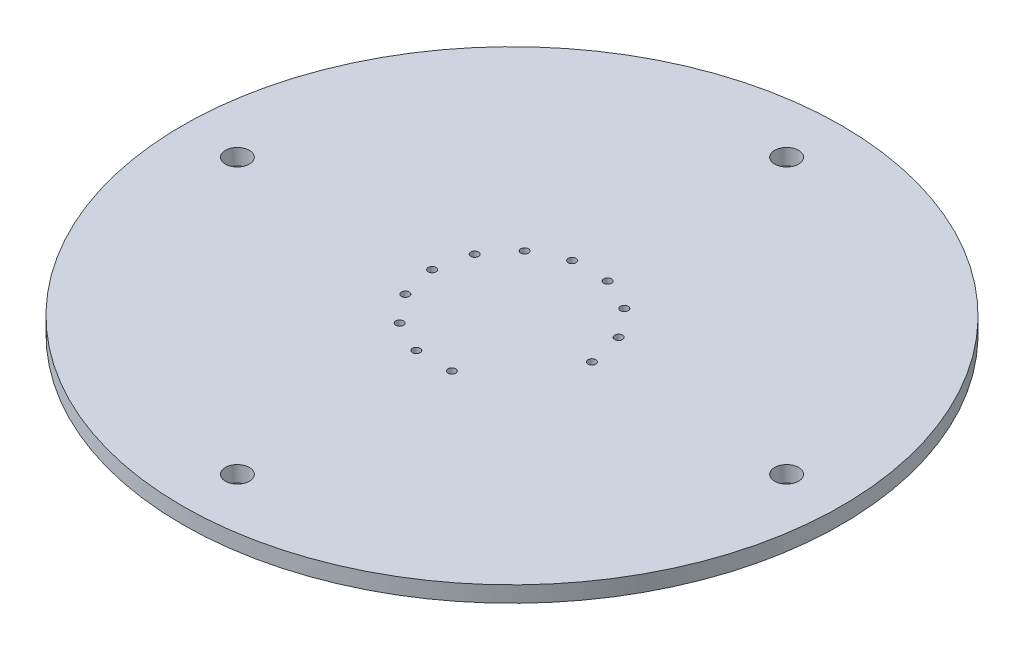
ISO-10303-21;
HEADER;
FILE_DESCRIPTION(('STEP AP214'),'2;1');
FILE_NAME('part.step','',(''),(''),'','','');
FILE_SCHEMA(('AUTOMOTIVE_DESIGN { 1 0 10303 214 1 1 1 1 }'));
ENDSEC;
DATA;
#1=APPLICATION_CONTEXT('core data for automotive mechanical design processes');
#2=APPLICATION_PROTOCOL_DEFINITION('international standard','automotive_design',2000,#1);
#3=PRODUCT_CONTEXT('',#1,'mechanical');
#4=PRODUCT('Part','Part','',(#3));
#5=PRODUCT_RELATED_PRODUCT_CATEGORY('part','',(#4));
#6=PRODUCT_DEFINITION_FORMATION('','',#4);
#7=PRODUCT_DEFINITION_CONTEXT('part definition',#1,'design');
#8=PRODUCT_DEFINITION('design','',#6,#7);
#9=PRODUCT_DEFINITION_SHAPE('','',#8);
#10=(LENGTH_UNIT() NAMED_UNIT(*) SI_UNIT(.MILLI.,.METRE.));
#11=(NAMED_UNIT(*) PLANE_ANGLE_UNIT() SI_UNIT($,.RADIAN.));
#12=(NAMED_UNIT(*) SI_UNIT($,.STERADIAN.) SOLID_ANGLE_UNIT());
#13=UNCERTAINTY_MEASURE_WITH_UNIT(LENGTH_MEASURE(1.E-05),#10,'distance_accuracy_value','');
#14=(GEOMETRIC_REPRESENTATION_CONTEXT(3) GLOBAL_UNCERTAINTY_ASSIGNED_CONTEXT((#13)) GLOBAL_UNIT_ASSIGNED_CONTEXT((#10,
#11,#12)) REPRESENTATION_CONTEXT('',''));
#15=CARTESIAN_POINT('',(0.,0.,0.));
#16=DIRECTION('',(0.,0.,1.));
#17=DIRECTION('',(1.,0.,0.));
#18=AXIS2_PLACEMENT_3D('',#15,#16,#17);
#19=CARTESIAN_POINT('',(0.,1.6,0.));
#20=DIRECTION('',(0.,-1.,0.));
#21=DIRECTION('',(0.,0.,-1.));
#22=AXIS2_PLACEMENT_3D('',#19,#20,#21);
#23=CYLINDRICAL_SURFACE('',#22,33.);
#24=CARTESIAN_POINT('',(0.,1.6,0.));
#25=DIRECTION('',(0.,1.,0.));
#26=DIRECTION('',(0.,0.,1.));
#27=AXIS2_PLACEMENT_3D('',#24,#25,#26);
#28=CIRCLE('',#27,33.);
#29=CARTESIAN_POINT('',(0.,1.6,33.));
#30=VERTEX_POINT('',#29);
#31=EDGE_CURVE('E10',#30,#30,#28,.T.);
#32=ORIENTED_EDGE('',*,*,#31,.F.);
#33=EDGE_LOOP('',(#32));
#34=FACE_BOUND('',#33,.T.);
#35=CARTESIAN_POINT('',(0.,0.,0.));
#36=DIRECTION('',(0.,1.,0.));
#37=DIRECTION('',(0.,0.,1.));
#38=AXIS2_PLACEMENT_3D('',#35,#36,#37);
#39=CIRCLE('',#38,33.);
#40=CARTESIAN_POINT('',(0.,0.,33.));
#41=VERTEX_POINT('',#40);
#42=EDGE_CURVE('E37',#41,#41,#39,.T.);
#43=ORIENTED_EDGE('',*,*,#42,.T.);
#44=EDGE_LOOP('',(#43));
#45=FACE_BOUND('',#44,.T.);
#46=ADVANCED_FACE('F30',(#34,#45),#23,.T.);
#47=CARTESIAN_POINT('',(0.,1.6,0.));
#48=DIRECTION('',(0.,1.,0.));
#49=DIRECTION('',(0.,0.,1.));
#50=AXIS2_PLACEMENT_3D('',#47,#48,#49);
#51=PLANE('',#50);
#52=CARTESIAN_POINT('',(-4.98791841486977,1.6,-6.25465185974432));
#53=DIRECTION('',(0.,1.,0.));
#54=DIRECTION('',(0.,0.,1.));
#55=AXIS2_PLACEMENT_3D('',#52,#53,#54);
#56=CIRCLE('',#55,0.39);
#57=CARTESIAN_POINT('',(-4.98791841486977,1.6,-5.86465185974432));
#58=VERTEX_POINT('',#57);
#59=EDGE_CURVE('E113',#58,#58,#56,.T.);
#60=ORIENTED_EDGE('',*,*,#59,.F.);
#61=EDGE_LOOP('',(#60));
#62=FACE_BOUND('',#61,.T.);
#63=CARTESIAN_POINT('',(-7.2077509432193,1.6,-3.47106991294058));
#64=DIRECTION('',(0.,1.,0.));
#65=DIRECTION('',(0.,0.,1.));
#66=AXIS2_PLACEMENT_3D('',#63,#64,#65);
#67=CIRCLE('',#66,0.39);
#68=CARTESIAN_POINT('',(-7.2077509432193,1.6,-3.08106991294058));
#69=VERTEX_POINT('',#68);
#70=EDGE_CURVE('E103',#69,#69,#67,.T.);
#71=ORIENTED_EDGE('',*,*,#70,.F.);
#72=EDGE_LOOP('',(#71));
#73=FACE_BOUND('',#72,.T.);
#74=CARTESIAN_POINT('',(-7.99999999999989,1.6,0.));
#75=DIRECTION('',(0.,1.,0.));
#76=DIRECTION('',(0.,0.,1.));
#77=AXIS2_PLACEMENT_3D('',#74,#75,#76);
#78=CIRCLE('',#77,0.390000000000175);
#79=CARTESIAN_POINT('',(-7.99999999999989,1.6,0.390000000000235));
#80=VERTEX_POINT('',#79);
#81=EDGE_CURVE('E100',#80,#80,#78,.T.);
#82=ORIENTED_EDGE('',*,*,#81,.F.);
#83=EDGE_LOOP('',(#82));
#84=FACE_BOUND('',#83,.T.);
#85=CARTESIAN_POINT('',(-7.20775094321921,1.6,3.47106991294052));
#86=DIRECTION('',(0.,1.,0.));
#87=DIRECTION('',(0.,0.,1.));
#88=AXIS2_PLACEMENT_3D('',#85,#86,#87);
#89=CIRCLE('',#88,0.390000000000215);
#90=CARTESIAN_POINT('',(-7.20775094321921,1.6,3.86106991294073));
#91=VERTEX_POINT('',#90);
#92=EDGE_CURVE('E97',#91,#91,#89,.T.);
#93=ORIENTED_EDGE('',*,*,#92,.F.);
#94=EDGE_LOOP('',(#93));
#95=FACE_BOUND('',#94,.T.);
#96=CARTESIAN_POINT('',(-4.9879184148697,1.6,6.25465185974427));
#97=DIRECTION('',(0.,1.,0.));
#98=DIRECTION('',(0.,0.,1.));
#99=AXIS2_PLACEMENT_3D('',#96,#97,#98);
#100=CIRCLE('',#99,0.390000000000247);
#101=CARTESIAN_POINT('',(-4.9879184148697,1.6,6.64465185974451));
#102=VERTEX_POINT('',#101);
#103=EDGE_CURVE('E93',#102,#102,#100,.T.);
#104=ORIENTED_EDGE('',*,*,#103,.F.);
#105=EDGE_LOOP('',(#104));
#106=FACE_BOUND('',#105,.T.);
#107=CARTESIAN_POINT('',(-1.78016747165033,1.6,7.79942329745458));
#108=DIRECTION('',(0.,1.,0.));
#109=DIRECTION('',(0.,0.,1.));
#110=AXIS2_PLACEMENT_3D('',#107,#108,#109);
#111=CIRCLE('',#110,0.390000000000271);
#112=CARTESIAN_POINT('',(-1.78016747165033,1.6,8.18942329745485));
#113=VERTEX_POINT('',#112);
#114=EDGE_CURVE('E89',#113,#113,#111,.T.);
#115=ORIENTED_EDGE('',*,*,#114,.F.);
#116=EDGE_LOOP('',(#115));
#117=FACE_BOUND('',#116,.T.);
#118=CARTESIAN_POINT('',(1.7801674716507,1.6,7.79942329745455));
#119=DIRECTION('',(0.,1.,0.));
#120=DIRECTION('',(0.,0.,1.));
#121=AXIS2_PLACEMENT_3D('',#118,#119,#120);
#122=CIRCLE('',#121,0.390000000000271);
#123=CARTESIAN_POINT('',(1.7801674716507,1.6,8.18942329745482));
#124=VERTEX_POINT('',#123);
#125=EDGE_CURVE('E85',#124,#124,#122,.T.);
#126=ORIENTED_EDGE('',*,*,#125,.F.);
#127=EDGE_LOOP('',(#126));
#128=FACE_BOUND('',#127,.T.);
#129=CARTESIAN_POINT('',(8.00000000000011,1.6,-1.08850241781335E-13));
#130=DIRECTION('',(0.,1.,0.));
#131=DIRECTION('',(0.,0.,1.));
#132=AXIS2_PLACEMENT_3D('',#129,#130,#131);
#133=CIRCLE('',#132,0.390000000000156);
#134=CARTESIAN_POINT('',(8.00000000000011,1.6,0.390000000000048));
#135=VERTEX_POINT('',#134);
#136=EDGE_CURVE('E81',#135,#135,#133,.T.);
#137=ORIENTED_EDGE('',*,*,#136,.F.);
#138=EDGE_LOOP('',(#137));
#139=FACE_BOUND('',#138,.T.);
#140=CARTESIAN_POINT('',(7.20775094321938,1.6,-3.47106991294042));
#141=DIRECTION('',(0.,1.,0.));
#142=DIRECTION('',(0.,0.,1.));
#143=AXIS2_PLACEMENT_3D('',#140,#141,#142);
#144=CIRCLE('',#143,0.389999999999999);
#145=CARTESIAN_POINT('',(7.20775094321938,1.6,-3.08106991294042));
#146=VERTEX_POINT('',#145);
#147=EDGE_CURVE('E77',#146,#146,#144,.T.);
#148=ORIENTED_EDGE('',*,*,#147,.F.);
#149=EDGE_LOOP('',(#148));
#150=FACE_BOUND('',#149,.T.);
#151=CARTESIAN_POINT('',(4.9879184148699,1.6,-6.25465185974422));
#152=DIRECTION('',(0.,1.,0.));
#153=DIRECTION('',(0.,0.,1.));
#154=AXIS2_PLACEMENT_3D('',#151,#152,#153);
#155=CIRCLE('',#154,0.39);
#156=CARTESIAN_POINT('',(4.9879184148699,1.6,-5.86465185974422));
#157=VERTEX_POINT('',#156);
#158=EDGE_CURVE('E73',#157,#157,#155,.T.);
#159=ORIENTED_EDGE('',*,*,#158,.F.);
#160=EDGE_LOOP('',(#159));
#161=FACE_BOUND('',#160,.T.);
#162=CARTESIAN_POINT('',(1.78016747165055,1.6,-7.79942329745458));
#163=DIRECTION('',(0.,1.,0.));
#164=DIRECTION('',(0.,0.,1.));
#165=AXIS2_PLACEMENT_3D('',#162,#163,#164);
#166=CIRCLE('',#165,0.39);
#167=CARTESIAN_POINT('',(1.78016747165055,1.6,-7.40942329745458));
#168=VERTEX_POINT('',#167);
#169=EDGE_CURVE('E69',#168,#168,#166,.T.);
#170=ORIENTED_EDGE('',*,*,#169,.F.);
#171=EDGE_LOOP('',(#170));
#172=FACE_BOUND('',#171,.T.);
#173=CARTESIAN_POINT('',(-1.78016747165049,1.6,-7.7994232974546));
#174=DIRECTION('',(0.,1.,0.));
#175=DIRECTION('',(0.,0.,1.));
#176=AXIS2_PLACEMENT_3D('',#173,#174,#175);
#177=CIRCLE('',#176,0.39);
#178=CARTESIAN_POINT('',(-1.78016747165049,1.6,-7.4094232974546));
#179=VERTEX_POINT('',#178);
#180=EDGE_CURVE('E65',#179,#179,#177,.T.);
#181=ORIENTED_EDGE('',*,*,#180,.F.);
#182=EDGE_LOOP('',(#181));
#183=FACE_BOUND('',#182,.T.);
#184=CARTESIAN_POINT('',(-27.5,1.6,0.));
#185=DIRECTION('',(0.,1.,0.));
#186=DIRECTION('',(0.,0.,1.));
#187=AXIS2_PLACEMENT_3D('',#184,#185,#186);
#188=CIRCLE('',#187,1.2);
#189=CARTESIAN_POINT('',(-27.5,1.6,1.2));
#190=VERTEX_POINT('',#189);
#191=EDGE_CURVE('E61',#190,#190,#188,.T.);
#192=ORIENTED_EDGE('',*,*,#191,.F.);
#193=EDGE_LOOP('',(#192));
#194=FACE_BOUND('',#193,.T.);
#195=CARTESIAN_POINT('',(-2.88047210454558E-13,1.6,27.5));
#196=DIRECTION('',(0.,1.,0.));
#197=DIRECTION('',(0.,0.,1.));
#198=AXIS2_PLACEMENT_3D('',#195,#196,#197);
#199=CIRCLE('',#198,1.2);
#200=CARTESIAN_POINT('',(-2.88047210454558E-13,1.6,28.7));
#201=VERTEX_POINT('',#200);
#202=EDGE_CURVE('E57',#201,#201,#199,.T.);
#203=ORIENTED_EDGE('',*,*,#202,.F.);
#204=EDGE_LOOP('',(#203));
#205=FACE_BOUND('',#204,.T.);
#206=CARTESIAN_POINT('',(27.5,1.6,1.92031473636372E-13));
#207=DIRECTION('',(0.,1.,0.));
#208=DIRECTION('',(0.,0.,1.));
#209=AXIS2_PLACEMENT_3D('',#206,#207,#208);
#210=CIRCLE('',#209,1.2);
#211=CARTESIAN_POINT('',(27.5,1.6,1.20000000000019));
#212=VERTEX_POINT('',#211);
#213=EDGE_CURVE('E53',#212,#212,#210,.T.);
#214=ORIENTED_EDGE('',*,*,#213,.F.);
#215=EDGE_LOOP('',(#214));
#216=FACE_BOUND('',#215,.T.);
#217=CARTESIAN_POINT('',(0.,1.6,-27.5));
#218=DIRECTION('',(0.,1.,0.));
#219=DIRECTION('',(0.,0.,1.));
#220=AXIS2_PLACEMENT_3D('',#217,#218,#219);
#221=CIRCLE('',#220,1.2);
#222=CARTESIAN_POINT('',(0.,1.6,-26.3));
#223=VERTEX_POINT('',#222);
#224=EDGE_CURVE('E45',#223,#223,#221,.T.);
#225=ORIENTED_EDGE('',*,*,#224,.F.);
#226=EDGE_LOOP('',(#225));
#227=FACE_BOUND('',#226,.T.);
#228=ORIENTED_EDGE('',*,*,#31,.T.);
#229=EDGE_LOOP('',(#228));
#230=FACE_BOUND('',#229,.T.);
#231=ADVANCED_FACE('F144',(#62,#73,#84,#95,#106,#117,#128,#139,#150,#161,#172,#183,#194,#205,
#216,#227,#230),#51,.T.);
#232=CARTESIAN_POINT('',(0.,0.,0.));
#233=DIRECTION('',(0.,1.,0.));
#234=DIRECTION('',(0.,0.,1.));
#235=AXIS2_PLACEMENT_3D('',#232,#233,#234);
#236=PLANE('',#235);
#237=CARTESIAN_POINT('',(-4.98791841486977,0.,-6.25465185974432));
#238=DIRECTION('',(0.,1.,0.));
#239=DIRECTION('',(0.,0.,1.));
#240=AXIS2_PLACEMENT_3D('',#237,#238,#239);
#241=CIRCLE('',#240,0.39);
#242=CARTESIAN_POINT('',(-4.98791841486977,0.,-5.86465185974432));
#243=VERTEX_POINT('',#242);
#244=EDGE_CURVE('E33',#243,#243,#241,.T.);
#245=ORIENTED_EDGE('',*,*,#244,.T.);
#246=EDGE_LOOP('',(#245));
#247=FACE_BOUND('',#246,.T.);
#248=CARTESIAN_POINT('',(-7.2077509432193,0.,-3.47106991294058));
#249=DIRECTION('',(0.,1.,0.));
#250=DIRECTION('',(0.,0.,1.));
#251=AXIS2_PLACEMENT_3D('',#248,#249,#250);
#252=CIRCLE('',#251,0.39);
#253=CARTESIAN_POINT('',(-7.2077509432193,0.,-3.08106991294058));
#254=VERTEX_POINT('',#253);
#255=EDGE_CURVE('E101',#254,#254,#252,.T.);
#256=ORIENTED_EDGE('',*,*,#255,.T.);
#257=EDGE_LOOP('',(#256));
#258=FACE_BOUND('',#257,.T.);
#259=CARTESIAN_POINT('',(-7.99999999999989,0.,0.));
#260=DIRECTION('',(0.,1.,0.));
#261=DIRECTION('',(0.,0.,1.));
#262=AXIS2_PLACEMENT_3D('',#259,#260,#261);
#263=CIRCLE('',#262,0.390000000000175);
#264=CARTESIAN_POINT('',(-7.99999999999989,0.,0.390000000000235));
#265=VERTEX_POINT('',#264);
#266=EDGE_CURVE('E98',#265,#265,#263,.T.);
#267=ORIENTED_EDGE('',*,*,#266,.T.);
#268=EDGE_LOOP('',(#267));
#269=FACE_BOUND('',#268,.T.);
#270=CARTESIAN_POINT('',(-7.20775094321921,0.,3.47106991294052));
#271=DIRECTION('',(0.,1.,0.));
#272=DIRECTION('',(0.,0.,1.));
#273=AXIS2_PLACEMENT_3D('',#270,#271,#272);
#274=CIRCLE('',#273,0.390000000000215);
#275=CARTESIAN_POINT('',(-7.20775094321921,0.,3.86106991294073));
#276=VERTEX_POINT('',#275);
#277=EDGE_CURVE('E94',#276,#276,#274,.T.);
#278=ORIENTED_EDGE('',*,*,#277,.T.);
#279=EDGE_LOOP('',(#278));
#280=FACE_BOUND('',#279,.T.);
#281=CARTESIAN_POINT('',(-4.9879184148697,0.,6.25465185974427));
#282=DIRECTION('',(0.,1.,0.));
#283=DIRECTION('',(0.,0.,1.));
#284=AXIS2_PLACEMENT_3D('',#281,#282,#283);
#285=CIRCLE('',#284,0.390000000000247);
#286=CARTESIAN_POINT('',(-4.9879184148697,0.,6.64465185974451));
#287=VERTEX_POINT('',#286);
#288=EDGE_CURVE('E90',#287,#287,#285,.T.);
#289=ORIENTED_EDGE('',*,*,#288,.T.);
#290=EDGE_LOOP('',(#289));
#291=FACE_BOUND('',#290,.T.);
#292=CARTESIAN_POINT('',(-1.78016747165033,0.,7.79942329745458));
#293=DIRECTION('',(0.,1.,0.));
#294=DIRECTION('',(0.,0.,1.));
#295=AXIS2_PLACEMENT_3D('',#292,#293,#294);
#296=CIRCLE('',#295,0.390000000000271);
#297=CARTESIAN_POINT('',(-1.78016747165033,0.,8.18942329745485));
#298=VERTEX_POINT('',#297);
#299=EDGE_CURVE('E86',#298,#298,#296,.T.);
#300=ORIENTED_EDGE('',*,*,#299,.T.);
#301=EDGE_LOOP('',(#300));
#302=FACE_BOUND('',#301,.T.);
#303=CARTESIAN_POINT('',(1.7801674716507,0.,7.79942329745455));
#304=DIRECTION('',(0.,1.,0.));
#305=DIRECTION('',(0.,0.,1.));
#306=AXIS2_PLACEMENT_3D('',#303,#304,#305);
#307=CIRCLE('',#306,0.390000000000271);
#308=CARTESIAN_POINT('',(1.7801674716507,0.,8.18942329745482));
#309=VERTEX_POINT('',#308);
#310=EDGE_CURVE('E82',#309,#309,#307,.T.);
#311=ORIENTED_EDGE('',*,*,#310,.T.);
#312=EDGE_LOOP('',(#311));
#313=FACE_BOUND('',#312,.T.);
#314=CARTESIAN_POINT('',(8.00000000000011,0.,-1.08850241781335E-13));
#315=DIRECTION('',(0.,1.,0.));
#316=DIRECTION('',(0.,0.,1.));
#317=AXIS2_PLACEMENT_3D('',#314,#315,#316);
#318=CIRCLE('',#317,0.390000000000156);
#319=CARTESIAN_POINT('',(8.00000000000011,0.,0.390000000000048));
#320=VERTEX_POINT('',#319);
#321=EDGE_CURVE('E78',#320,#320,#318,.T.);
#322=ORIENTED_EDGE('',*,*,#321,.T.);
#323=EDGE_LOOP('',(#322));
#324=FACE_BOUND('',#323,.T.);
#325=CARTESIAN_POINT('',(7.20775094321938,0.,-3.47106991294042));
#326=DIRECTION('',(0.,1.,0.));
#327=DIRECTION('',(0.,0.,1.));
#328=AXIS2_PLACEMENT_3D('',#325,#326,#327);
#329=CIRCLE('',#328,0.389999999999999);
#330=CARTESIAN_POINT('',(7.20775094321938,0.,-3.08106991294042));
#331=VERTEX_POINT('',#330);
#332=EDGE_CURVE('E74',#331,#331,#329,.T.);
#333=ORIENTED_EDGE('',*,*,#332,.T.);
#334=EDGE_LOOP('',(#333));
#335=FACE_BOUND('',#334,.T.);
#336=CARTESIAN_POINT('',(4.9879184148699,0.,-6.25465185974422));
#337=DIRECTION('',(0.,1.,0.));
#338=DIRECTION('',(0.,0.,1.));
#339=AXIS2_PLACEMENT_3D('',#336,#337,#338);
#340=CIRCLE('',#339,0.39);
#341=CARTESIAN_POINT('',(4.9879184148699,0.,-5.86465185974422));
#342=VERTEX_POINT('',#341);
#343=EDGE_CURVE('E70',#342,#342,#340,.T.);
#344=ORIENTED_EDGE('',*,*,#343,.T.);
#345=EDGE_LOOP('',(#344));
#346=FACE_BOUND('',#345,.T.);
#347=CARTESIAN_POINT('',(1.78016747165055,0.,-7.79942329745458));
#348=DIRECTION('',(0.,1.,0.));
#349=DIRECTION('',(0.,0.,1.));
#350=AXIS2_PLACEMENT_3D('',#347,#348,#349);
#351=CIRCLE('',#350,0.39);
#352=CARTESIAN_POINT('',(1.78016747165055,0.,-7.40942329745458));
#353=VERTEX_POINT('',#352);
#354=EDGE_CURVE('E66',#353,#353,#351,.T.);
#355=ORIENTED_EDGE('',*,*,#354,.T.);
#356=EDGE_LOOP('',(#355));
#357=FACE_BOUND('',#356,.T.);
#358=CARTESIAN_POINT('',(-1.78016747165049,0.,-7.7994232974546));
#359=DIRECTION('',(0.,1.,0.));
#360=DIRECTION('',(0.,0.,1.));
#361=AXIS2_PLACEMENT_3D('',#358,#359,#360);
#362=CIRCLE('',#361,0.39);
#363=CARTESIAN_POINT('',(-1.78016747165049,0.,-7.4094232974546));
#364=VERTEX_POINT('',#363);
#365=EDGE_CURVE('E62',#364,#364,#362,.T.);
#366=ORIENTED_EDGE('',*,*,#365,.T.);
#367=EDGE_LOOP('',(#366));
#368=FACE_BOUND('',#367,.T.);
#369=CARTESIAN_POINT('',(0.,0.,0.));
#370=DIRECTION('',(0.,1.,0.));
#371=DIRECTION('',(0.,0.,1.));
#372=AXIS2_PLACEMENT_3D('',#369,#370,#371);
#373=CIRCLE('',#372,3.75);
#374=CARTESIAN_POINT('',(0.,0.,3.75));
#375=VERTEX_POINT('',#374);
#376=EDGE_CURVE('E363',#375,#375,#373,.T.);
#377=ORIENTED_EDGE('',*,*,#376,.T.);
#378=EDGE_LOOP('',(#377));
#379=FACE_BOUND('',#378,.T.);
#380=CARTESIAN_POINT('',(-27.5,0.,0.));
#381=DIRECTION('',(0.,1.,0.));
#382=DIRECTION('',(0.,0.,1.));
#383=AXIS2_PLACEMENT_3D('',#380,#381,#382);
#384=CIRCLE('',#383,1.2);
#385=CARTESIAN_POINT('',(-27.5,0.,1.2));
#386=VERTEX_POINT('',#385);
#387=EDGE_CURVE('E58',#386,#386,#384,.T.);
#388=ORIENTED_EDGE('',*,*,#387,.T.);
#389=EDGE_LOOP('',(#388));
#390=FACE_BOUND('',#389,.T.);
#391=CARTESIAN_POINT('',(-2.88047210454558E-13,0.,27.5));
#392=DIRECTION('',(0.,1.,0.));
#393=DIRECTION('',(0.,0.,1.));
#394=AXIS2_PLACEMENT_3D('',#391,#392,#393);
#395=CIRCLE('',#394,1.2);
#396=CARTESIAN_POINT('',(-2.88047210454558E-13,0.,28.7));
#397=VERTEX_POINT('',#396);
#398=EDGE_CURVE('E54',#397,#397,#395,.T.);
#399=ORIENTED_EDGE('',*,*,#398,.T.);
#400=EDGE_LOOP('',(#399));
#401=FACE_BOUND('',#400,.T.);
#402=CARTESIAN_POINT('',(27.5,0.,1.92031473636372E-13));
#403=DIRECTION('',(0.,1.,0.));
#404=DIRECTION('',(0.,0.,1.));
#405=AXIS2_PLACEMENT_3D('',#402,#403,#404);
#406=CIRCLE('',#405,1.2);
#407=CARTESIAN_POINT('',(27.5,0.,1.20000000000019));
#408=VERTEX_POINT('',#407);
#409=EDGE_CURVE('E50',#408,#408,#406,.T.);
#410=ORIENTED_EDGE('',*,*,#409,.T.);
#411=EDGE_LOOP('',(#410));
#412=FACE_BOUND('',#411,.T.);
#413=CARTESIAN_POINT('',(0.,0.,-27.5));
#414=DIRECTION('',(0.,1.,0.));
#415=DIRECTION('',(0.,0.,1.));
#416=AXIS2_PLACEMENT_3D('',#413,#414,#415);
#417=CIRCLE('',#416,1.2);
#418=CARTESIAN_POINT('',(0.,0.,-26.3));
#419=VERTEX_POINT('',#418);
#420=EDGE_CURVE('E42',#419,#419,#417,.T.);
#421=ORIENTED_EDGE('',*,*,#420,.T.);
#422=EDGE_LOOP('',(#421));
#423=FACE_BOUND('',#422,.T.);
#424=ORIENTED_EDGE('',*,*,#42,.F.);
#425=EDGE_LOOP('',(#424));
#426=FACE_BOUND('',#425,.T.);
#427=ADVANCED_FACE('F147',(#247,#258,#269,#280,#291,#302,#313,#324,#335,#346,#357,#368,#379,
#390,#401,#412,#423,#426),#236,.F.);
#428=CARTESIAN_POINT('',(0.,-1.4,-27.5));
#429=DIRECTION('',(0.,1.,0.));
#430=DIRECTION('',(0.,0.,1.));
#431=AXIS2_PLACEMENT_3D('',#428,#429,#430);
#432=CYLINDRICAL_SURFACE('',#431,1.2);
#433=ORIENTED_EDGE('',*,*,#224,.T.);
#434=EDGE_LOOP('',(#433));
#435=FACE_BOUND('',#434,.T.);
#436=ORIENTED_EDGE('',*,*,#420,.F.);
#437=EDGE_LOOP('',(#436));
#438=FACE_BOUND('',#437,.T.);
#439=ADVANCED_FACE('F153',(#435,#438),#432,.F.);
#440=CARTESIAN_POINT('',(27.5,-1.4,1.92031473636372E-13));
#441=DIRECTION('',(0.,1.,0.));
#442=DIRECTION('',(0.,0.,1.));
#443=AXIS2_PLACEMENT_3D('',#440,#441,#442);
#444=CYLINDRICAL_SURFACE('',#443,1.2);
#445=ORIENTED_EDGE('',*,*,#213,.T.);
#446=EDGE_LOOP('',(#445));
#447=FACE_BOUND('',#446,.T.);
#448=ORIENTED_EDGE('',*,*,#409,.F.);
#449=EDGE_LOOP('',(#448));
#450=FACE_BOUND('',#449,.T.);
#451=ADVANCED_FACE('F141',(#447,#450),#444,.F.);
#452=CARTESIAN_POINT('',(-2.88047210454558E-13,-1.4,27.5));
#453=DIRECTION('',(0.,1.,0.));
#454=DIRECTION('',(0.,0.,1.));
#455=AXIS2_PLACEMENT_3D('',#452,#453,#454);
#456=CYLINDRICAL_SURFACE('',#455,1.2);
#457=ORIENTED_EDGE('',*,*,#202,.T.);
#458=EDGE_LOOP('',(#457));
#459=FACE_BOUND('',#458,.T.);
#460=ORIENTED_EDGE('',*,*,#398,.F.);
#461=EDGE_LOOP('',(#460));
#462=FACE_BOUND('',#461,.T.);
#463=ADVANCED_FACE('F190',(#459,#462),#456,.F.);
#464=CARTESIAN_POINT('',(-27.5,-1.4,0.));
#465=DIRECTION('',(0.,1.,0.));
#466=DIRECTION('',(0.,0.,1.));
#467=AXIS2_PLACEMENT_3D('',#464,#465,#466);
#468=CYLINDRICAL_SURFACE('',#467,1.2);
#469=ORIENTED_EDGE('',*,*,#191,.T.);
#470=EDGE_LOOP('',(#469));
#471=FACE_BOUND('',#470,.T.);
#472=ORIENTED_EDGE('',*,*,#387,.F.);
#473=EDGE_LOOP('',(#472));
#474=FACE_BOUND('',#473,.T.);
#475=ADVANCED_FACE('F197',(#471,#474),#468,.F.);
#476=CARTESIAN_POINT('',(-1.78016747165049,-8.4,-7.7994232974546));
#477=DIRECTION('',(0.,1.,0.));
#478=DIRECTION('',(0.,0.,1.));
#479=AXIS2_PLACEMENT_3D('',#476,#477,#478);
#480=CYLINDRICAL_SURFACE('',#479,0.39);
#481=ORIENTED_EDGE('',*,*,#180,.T.);
#482=EDGE_LOOP('',(#481));
#483=FACE_BOUND('',#482,.T.);
#484=ORIENTED_EDGE('',*,*,#365,.F.);
#485=EDGE_LOOP('',(#484));
#486=FACE_BOUND('',#485,.T.);
#487=ADVANCED_FACE('F204',(#483,#486),#480,.F.);
#488=CARTESIAN_POINT('',(1.78016747165055,-8.4,-7.79942329745458));
#489=DIRECTION('',(0.,1.,0.));
#490=DIRECTION('',(0.,0.,1.));
#491=AXIS2_PLACEMENT_3D('',#488,#489,#490);
#492=CYLINDRICAL_SURFACE('',#491,0.39);
#493=ORIENTED_EDGE('',*,*,#169,.T.);
#494=EDGE_LOOP('',(#493));
#495=FACE_BOUND('',#494,.T.);
#496=ORIENTED_EDGE('',*,*,#354,.F.);
#497=EDGE_LOOP('',(#496));
#498=FACE_BOUND('',#497,.T.);
#499=ADVANCED_FACE('F211',(#495,#498),#492,.F.);
#500=CARTESIAN_POINT('',(4.9879184148699,-8.4,-6.25465185974422));
#501=DIRECTION('',(0.,1.,0.));
#502=DIRECTION('',(0.,0.,1.));
#503=AXIS2_PLACEMENT_3D('',#500,#501,#502);
#504=CYLINDRICAL_SURFACE('',#503,0.39);
#505=ORIENTED_EDGE('',*,*,#158,.T.);
#506=EDGE_LOOP('',(#505));
#507=FACE_BOUND('',#506,.T.);
#508=ORIENTED_EDGE('',*,*,#343,.F.);
#509=EDGE_LOOP('',(#508));
#510=FACE_BOUND('',#509,.T.);
#511=ADVANCED_FACE('F219',(#507,#510),#504,.F.);
#512=CARTESIAN_POINT('',(7.20775094321938,-8.4,-3.47106991294042));
#513=DIRECTION('',(0.,1.,0.));
#514=DIRECTION('',(0.,0.,1.));
#515=AXIS2_PLACEMENT_3D('',#512,#513,#514);
#516=CYLINDRICAL_SURFACE('',#515,0.389999999999999);
#517=ORIENTED_EDGE('',*,*,#147,.T.);
#518=EDGE_LOOP('',(#517));
#519=FACE_BOUND('',#518,.T.);
#520=ORIENTED_EDGE('',*,*,#332,.F.);
#521=EDGE_LOOP('',(#520));
#522=FACE_BOUND('',#521,.T.);
#523=ADVANCED_FACE('F227',(#519,#522),#516,.F.);
#524=CARTESIAN_POINT('',(8.00000000000011,-8.4,-1.08850241781335E-13));
#525=DIRECTION('',(0.,1.,0.));
#526=DIRECTION('',(0.,0.,1.));
#527=AXIS2_PLACEMENT_3D('',#524,#525,#526);
#528=CYLINDRICAL_SURFACE('',#527,0.390000000000156);
#529=ORIENTED_EDGE('',*,*,#136,.T.);
#530=EDGE_LOOP('',(#529));
#531=FACE_BOUND('',#530,.T.);
#532=ORIENTED_EDGE('',*,*,#321,.F.);
#533=EDGE_LOOP('',(#532));
#534=FACE_BOUND('',#533,.T.);
#535=ADVANCED_FACE('F235',(#531,#534),#528,.F.);
#536=CARTESIAN_POINT('',(1.7801674716507,-8.4,7.79942329745455));
#537=DIRECTION('',(0.,1.,0.));
#538=DIRECTION('',(0.,0.,1.));
#539=AXIS2_PLACEMENT_3D('',#536,#537,#538);
#540=CYLINDRICAL_SURFACE('',#539,0.390000000000271);
#541=ORIENTED_EDGE('',*,*,#125,.T.);
#542=EDGE_LOOP('',(#541));
#543=FACE_BOUND('',#542,.T.);
#544=ORIENTED_EDGE('',*,*,#310,.F.);
#545=EDGE_LOOP('',(#544));
#546=FACE_BOUND('',#545,.T.);
#547=ADVANCED_FACE('F243',(#543,#546),#540,.F.);
#548=CARTESIAN_POINT('',(-1.78016747165033,-8.4,7.79942329745458));
#549=DIRECTION('',(0.,1.,0.));
#550=DIRECTION('',(0.,0.,1.));
#551=AXIS2_PLACEMENT_3D('',#548,#549,#550);
#552=CYLINDRICAL_SURFACE('',#551,0.390000000000271);
#553=ORIENTED_EDGE('',*,*,#114,.T.);
#554=EDGE_LOOP('',(#553));
#555=FACE_BOUND('',#554,.T.);
#556=ORIENTED_EDGE('',*,*,#299,.F.);
#557=EDGE_LOOP('',(#556));
#558=FACE_BOUND('',#557,.T.);
#559=ADVANCED_FACE('F251',(#555,#558),#552,.F.);
#560=CARTESIAN_POINT('',(-4.9879184148697,-8.4,6.25465185974427));
#561=DIRECTION('',(0.,1.,0.));
#562=DIRECTION('',(0.,0.,1.));
#563=AXIS2_PLACEMENT_3D('',#560,#561,#562);
#564=CYLINDRICAL_SURFACE('',#563,0.390000000000247);
#565=ORIENTED_EDGE('',*,*,#103,.T.);
#566=EDGE_LOOP('',(#565));
#567=FACE_BOUND('',#566,.T.);
#568=ORIENTED_EDGE('',*,*,#288,.F.);
#569=EDGE_LOOP('',(#568));
#570=FACE_BOUND('',#569,.T.);
#571=ADVANCED_FACE('F259',(#567,#570),#564,.F.);
#572=CARTESIAN_POINT('',(-7.20775094321921,-8.4,3.47106991294052));
#573=DIRECTION('',(0.,1.,0.));
#574=DIRECTION('',(0.,0.,1.));
#575=AXIS2_PLACEMENT_3D('',#572,#573,#574);
#576=CYLINDRICAL_SURFACE('',#575,0.390000000000215);
#577=ORIENTED_EDGE('',*,*,#92,.T.);
#578=EDGE_LOOP('',(#577));
#579=FACE_BOUND('',#578,.T.);
#580=ORIENTED_EDGE('',*,*,#277,.F.);
#581=EDGE_LOOP('',(#580));
#582=FACE_BOUND('',#581,.T.);
#583=ADVANCED_FACE('F267',(#579,#582),#576,.F.);
#584=CARTESIAN_POINT('',(-7.99999999999989,-8.4,0.));
#585=DIRECTION('',(0.,1.,0.));
#586=DIRECTION('',(0.,0.,1.));
#587=AXIS2_PLACEMENT_3D('',#584,#585,#586);
#588=CYLINDRICAL_SURFACE('',#587,0.390000000000175);
#589=ORIENTED_EDGE('',*,*,#81,.T.);
#590=EDGE_LOOP('',(#589));
#591=FACE_BOUND('',#590,.T.);
#592=ORIENTED_EDGE('',*,*,#266,.F.);
#593=EDGE_LOOP('',(#592));
#594=FACE_BOUND('',#593,.T.);
#595=ADVANCED_FACE('F275',(#591,#594),#588,.F.);
#596=CARTESIAN_POINT('',(-7.2077509432193,-8.4,-3.47106991294058));
#597=DIRECTION('',(0.,1.,0.));
#598=DIRECTION('',(0.,0.,1.));
#599=AXIS2_PLACEMENT_3D('',#596,#597,#598);
#600=CYLINDRICAL_SURFACE('',#599,0.39);
#601=ORIENTED_EDGE('',*,*,#70,.T.);
#602=EDGE_LOOP('',(#601));
#603=FACE_BOUND('',#602,.T.);
#604=ORIENTED_EDGE('',*,*,#255,.F.);
#605=EDGE_LOOP('',(#604));
#606=FACE_BOUND('',#605,.T.);
#607=ADVANCED_FACE('F283',(#603,#606),#600,.F.);
#608=CARTESIAN_POINT('',(-4.98791841486977,-8.4,-6.25465185974432));
#609=DIRECTION('',(0.,1.,0.));
#610=DIRECTION('',(0.,0.,1.));
#611=AXIS2_PLACEMENT_3D('',#608,#609,#610);
#612=CYLINDRICAL_SURFACE('',#611,0.39);
#613=ORIENTED_EDGE('',*,*,#59,.T.);
#614=EDGE_LOOP('',(#613));
#615=FACE_BOUND('',#614,.T.);
#616=ORIENTED_EDGE('',*,*,#244,.F.);
#617=EDGE_LOOP('',(#616));
#618=FACE_BOUND('',#617,.T.);
#619=ADVANCED_FACE('F291',(#615,#618),#612,.F.);
#620=CARTESIAN_POINT('',(0.,-0.1,0.));
#621=DIRECTION('',(0.,1.,0.));
#622=DIRECTION('',(0.,0.,1.));
#623=AXIS2_PLACEMENT_3D('',#620,#621,#622);
#624=CYLINDRICAL_SURFACE('',#623,3.75);
#625=CARTESIAN_POINT('',(0.,-0.1,0.));
#626=DIRECTION('',(0.,1.,0.));
#627=DIRECTION('',(0.,0.,1.));
#628=AXIS2_PLACEMENT_3D('',#625,#626,#627);
#629=CIRCLE('',#628,3.75);
#630=CARTESIAN_POINT('',(0.,-0.1,3.75));
#631=VERTEX_POINT('',#630);
#632=EDGE_CURVE('E362',#631,#631,#629,.T.);
#633=ORIENTED_EDGE('',*,*,#632,.T.);
#634=EDGE_LOOP('',(#633));
#635=FACE_BOUND('',#634,.T.);
#636=ORIENTED_EDGE('',*,*,#376,.F.);
#637=EDGE_LOOP('',(#636));
#638=FACE_BOUND('',#637,.T.);
#639=ADVANCED_FACE('F297',(#635,#638),#624,.T.);
#640=CARTESIAN_POINT('',(0.,-0.1,0.));
#641=DIRECTION('',(0.,1.,0.));
#642=DIRECTION('',(0.,0.,1.));
#643=AXIS2_PLACEMENT_3D('',#640,#641,#642);
#644=PLANE('',#643);
#645=ORIENTED_EDGE('',*,*,#632,.F.);
#646=EDGE_LOOP('',(#645));
#647=FACE_BOUND('',#646,.T.);
#648=ADVANCED_FACE('F304',(#647),#644,.F.);
#649=CLOSED_SHELL('',(#46,#231,#427,#439,#451,#463,#475,#487,#499,#511,#523,#535,#547,#559,#571,
#583,#595,#607,#619,#639,#648));
#650=MANIFOLD_SOLID_BREP('B2',#649);
#651=ADVANCED_BREP_SHAPE_REPRESENTATION('',(#18,#650),#14);
#652=SHAPE_DEFINITION_REPRESENTATION(#9,#651);
ENDSEC;
END-ISO-10303-21;
